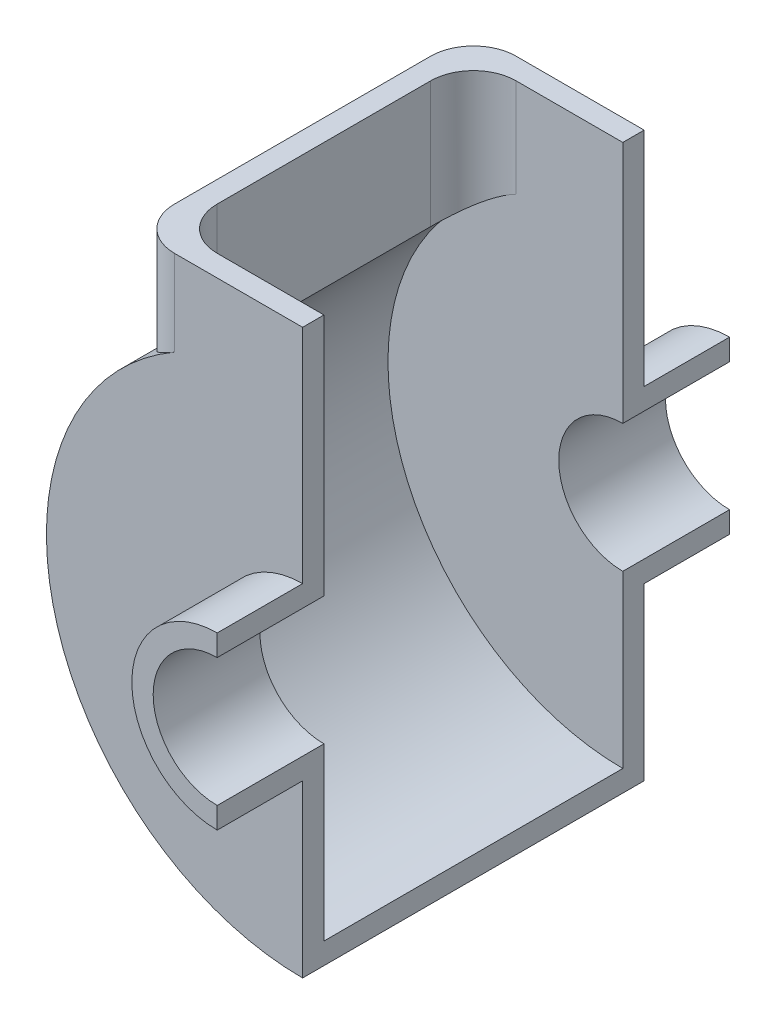
ISO-10303-21;
HEADER;
FILE_DESCRIPTION(('STEP AP214'),'2;1');
FILE_NAME('part.step','',(''),(''),'','','');
FILE_SCHEMA(('AUTOMOTIVE_DESIGN { 1 0 10303 214 1 1 1 1 }'));
ENDSEC;
DATA;
#1=APPLICATION_CONTEXT('core data for automotive mechanical design processes');
#2=APPLICATION_PROTOCOL_DEFINITION('international standard','automotive_design',2000,#1);
#3=PRODUCT_CONTEXT('',#1,'mechanical');
#4=PRODUCT('Part','Part','',(#3));
#5=PRODUCT_RELATED_PRODUCT_CATEGORY('part','',(#4));
#6=PRODUCT_DEFINITION_FORMATION('','',#4);
#7=PRODUCT_DEFINITION_CONTEXT('part definition',#1,'design');
#8=PRODUCT_DEFINITION('design','',#6,#7);
#9=PRODUCT_DEFINITION_SHAPE('','',#8);
#10=(LENGTH_UNIT() NAMED_UNIT(*) SI_UNIT(.MILLI.,.METRE.));
#11=(NAMED_UNIT(*) PLANE_ANGLE_UNIT() SI_UNIT($,.RADIAN.));
#12=(NAMED_UNIT(*) SI_UNIT($,.STERADIAN.) SOLID_ANGLE_UNIT());
#13=UNCERTAINTY_MEASURE_WITH_UNIT(LENGTH_MEASURE(1.E-05),#10,'distance_accuracy_value','');
#14=(GEOMETRIC_REPRESENTATION_CONTEXT(3) GLOBAL_UNCERTAINTY_ASSIGNED_CONTEXT((#13)) GLOBAL_UNIT_ASSIGNED_CONTEXT((#10,
#11,#12)) REPRESENTATION_CONTEXT('',''));
#15=CARTESIAN_POINT('',(0.,0.,0.));
#16=DIRECTION('',(0.,0.,1.));
#17=DIRECTION('',(1.,0.,0.));
#18=AXIS2_PLACEMENT_3D('',#15,#16,#17);
#19=CARTESIAN_POINT('',(0.,0.,25.));
#20=DIRECTION('',(0.,0.,-1.));
#21=DIRECTION('',(-1.,0.,0.));
#22=AXIS2_PLACEMENT_3D('',#19,#20,#21);
#23=CYLINDRICAL_SURFACE('',#22,20.);
#24=CARTESIAN_POINT('',(0.,0.,5.));
#25=DIRECTION('',(0.,0.,1.));
#26=DIRECTION('',(1.,0.,0.));
#27=AXIS2_PLACEMENT_3D('',#24,#25,#26);
#28=CIRCLE('',#27,20.);
#29=CARTESIAN_POINT('',(0.,20.,5.));
#30=VERTEX_POINT('',#29);
#31=CARTESIAN_POINT('',(0.,-20.,5.));
#32=VERTEX_POINT('',#31);
#33=EDGE_CURVE('E273',#30,#32,#28,.T.);
#34=ORIENTED_EDGE('',*,*,#33,.T.);
#35=DIRECTION('',(0.,0.,-1.));
#36=VECTOR('',#35,1.);
#37=CARTESIAN_POINT('',(0.,-20.,25.));
#38=LINE('',#37,#36);
#39=CARTESIAN_POINT('',(0.,-20.,25.));
#40=VERTEX_POINT('',#39);
#41=EDGE_CURVE('E308',#40,#32,#38,.T.);
#42=ORIENTED_EDGE('',*,*,#41,.F.);
#43=CARTESIAN_POINT('',(0.,0.,25.));
#44=DIRECTION('',(0.,0.,1.));
#45=DIRECTION('',(1.,0.,0.));
#46=AXIS2_PLACEMENT_3D('',#43,#44,#45);
#47=CIRCLE('',#46,20.);
#48=CARTESIAN_POINT('',(0.,20.,25.));
#49=VERTEX_POINT('',#48);
#50=EDGE_CURVE('E289',#49,#40,#47,.T.);
#51=ORIENTED_EDGE('',*,*,#50,.F.);
#52=DIRECTION('',(0.,0.,-1.));
#53=VECTOR('',#52,1.);
#54=CARTESIAN_POINT('',(0.,20.,25.));
#55=LINE('',#54,#53);
#56=EDGE_CURVE('E310',#49,#30,#55,.T.);
#57=ORIENTED_EDGE('',*,*,#56,.T.);
#58=EDGE_LOOP('',(#34,#42,#51,#57));
#59=FACE_BOUND('',#58,.T.);
#60=ADVANCED_FACE('F46',(#59),#23,.T.);
#61=CARTESIAN_POINT('',(0.,15.,25.));
#62=DIRECTION('',(-1.,0.,0.));
#63=DIRECTION('',(0.,-1.,0.));
#64=AXIS2_PLACEMENT_3D('',#61,#62,#63);
#65=PLANE('',#64);
#66=DIRECTION('',(0.,1.,0.));
#67=VECTOR('',#66,1.);
#68=CARTESIAN_POINT('',(0.,15.,0.));
#69=LINE('',#68,#67);
#70=CARTESIAN_POINT('',(0.,15.,0.));
#71=VERTEX_POINT('',#70);
#72=CARTESIAN_POINT('',(0.,72.,0.));
#73=VERTEX_POINT('',#72);
#74=EDGE_CURVE('E285',#71,#73,#69,.T.);
#75=ORIENTED_EDGE('',*,*,#74,.T.);
#76=DIRECTION('',(0.,0.,-1.));
#77=VECTOR('',#76,1.);
#78=CARTESIAN_POINT('',(0.,72.,5.));
#79=LINE('',#78,#77);
#80=CARTESIAN_POINT('',(0.,72.,5.));
#81=VERTEX_POINT('',#80);
#82=EDGE_CURVE('E201',#81,#73,#79,.T.);
#83=ORIENTED_EDGE('',*,*,#82,.F.);
#84=DIRECTION('',(0.,1.,0.));
#85=VECTOR('',#84,1.);
#86=CARTESIAN_POINT('',(0.,20.,5.));
#87=LINE('',#86,#85);
#88=EDGE_CURVE('E275',#30,#81,#87,.T.);
#89=ORIENTED_EDGE('',*,*,#88,.F.);
#90=ORIENTED_EDGE('',*,*,#56,.F.);
#91=DIRECTION('',(0.,1.,0.));
#92=VECTOR('',#91,1.);
#93=CARTESIAN_POINT('',(0.,15.,25.));
#94=LINE('',#93,#92);
#95=CARTESIAN_POINT('',(0.,15.,25.));
#96=VERTEX_POINT('',#95);
#97=EDGE_CURVE('E286',#96,#49,#94,.T.);
#98=ORIENTED_EDGE('',*,*,#97,.F.);
#99=DIRECTION('',(0.,0.,-1.));
#100=VECTOR('',#99,1.);
#101=CARTESIAN_POINT('',(0.,15.,25.));
#102=LINE('',#101,#100);
#103=EDGE_CURVE('E298',#96,#71,#102,.T.);
#104=ORIENTED_EDGE('',*,*,#103,.T.);
#105=EDGE_LOOP('',(#75,#83,#89,#90,#98,#104));
#106=FACE_BOUND('',#105,.T.);
#107=ADVANCED_FACE('F389',(#106),#65,.F.);
#108=CARTESIAN_POINT('',(0.,-15.,25.));
#109=DIRECTION('',(1.,0.,0.));
#110=DIRECTION('',(0.,1.,0.));
#111=AXIS2_PLACEMENT_3D('',#108,#109,#110);
#112=PLANE('',#111);
#113=DIRECTION('',(0.,-1.,0.));
#114=VECTOR('',#113,1.);
#115=CARTESIAN_POINT('',(0.,-15.,0.));
#116=LINE('',#115,#114);
#117=CARTESIAN_POINT('',(0.,-15.,0.));
#118=VERTEX_POINT('',#117);
#119=CARTESIAN_POINT('',(0.,-55.,0.));
#120=VERTEX_POINT('',#119);
#121=EDGE_CURVE('E300',#118,#120,#116,.T.);
#122=ORIENTED_EDGE('',*,*,#121,.F.);
#123=DIRECTION('',(0.,0.,-1.));
#124=VECTOR('',#123,1.);
#125=CARTESIAN_POINT('',(0.,-15.,25.));
#126=LINE('',#125,#124);
#127=CARTESIAN_POINT('',(0.,-15.,25.));
#128=VERTEX_POINT('',#127);
#129=EDGE_CURVE('E306',#128,#118,#126,.T.);
#130=ORIENTED_EDGE('',*,*,#129,.F.);
#131=DIRECTION('',(0.,-1.,0.));
#132=VECTOR('',#131,1.);
#133=CARTESIAN_POINT('',(0.,-15.,25.));
#134=LINE('',#133,#132);
#135=EDGE_CURVE('E292',#128,#40,#134,.T.);
#136=ORIENTED_EDGE('',*,*,#135,.T.);
#137=ORIENTED_EDGE('',*,*,#41,.T.);
#138=DIRECTION('',(0.,-1.,0.));
#139=VECTOR('',#138,1.);
#140=CARTESIAN_POINT('',(0.,-20.,5.));
#141=LINE('',#140,#139);
#142=CARTESIAN_POINT('',(0.,-60.,5.));
#143=VERTEX_POINT('',#142);
#144=EDGE_CURVE('E199',#32,#143,#141,.T.);
#145=ORIENTED_EDGE('',*,*,#144,.T.);
#146=DIRECTION('',(0.,0.,-1.));
#147=VECTOR('',#146,1.);
#148=CARTESIAN_POINT('',(0.,-60.,5.));
#149=LINE('',#148,#147);
#150=CARTESIAN_POINT('',(0.,-60.,-75.));
#151=VERTEX_POINT('',#150);
#152=EDGE_CURVE('E189',#143,#151,#149,.T.);
#153=ORIENTED_EDGE('',*,*,#152,.T.);
#154=DIRECTION('',(0.,-1.,0.));
#155=VECTOR('',#154,1.);
#156=CARTESIAN_POINT('',(0.,-20.,-75.));
#157=LINE('',#156,#155);
#158=CARTESIAN_POINT('',(0.,-20.,-75.));
#159=VERTEX_POINT('',#158);
#160=EDGE_CURVE('E195',#159,#151,#157,.T.);
#161=ORIENTED_EDGE('',*,*,#160,.F.);
#162=DIRECTION('',(0.,0.,1.));
#163=VECTOR('',#162,1.);
#164=CARTESIAN_POINT('',(0.,-20.,-95.));
#165=LINE('',#164,#163);
#166=CARTESIAN_POINT('',(0.,-20.,-95.));
#167=VERTEX_POINT('',#166);
#168=EDGE_CURVE('E251',#167,#159,#165,.T.);
#169=ORIENTED_EDGE('',*,*,#168,.F.);
#170=DIRECTION('',(0.,-1.,0.));
#171=VECTOR('',#170,1.);
#172=CARTESIAN_POINT('',(0.,-15.,-95.));
#173=LINE('',#172,#171);
#174=CARTESIAN_POINT('',(0.,-15.,-95.));
#175=VERTEX_POINT('',#174);
#176=EDGE_CURVE('E235',#175,#167,#173,.T.);
#177=ORIENTED_EDGE('',*,*,#176,.F.);
#178=DIRECTION('',(0.,0.,1.));
#179=VECTOR('',#178,1.);
#180=CARTESIAN_POINT('',(0.,-15.,-95.));
#181=LINE('',#180,#179);
#182=CARTESIAN_POINT('',(0.,-15.,-70.));
#183=VERTEX_POINT('',#182);
#184=EDGE_CURVE('E248',#175,#183,#181,.T.);
#185=ORIENTED_EDGE('',*,*,#184,.T.);
#186=DIRECTION('',(0.,-1.,0.));
#187=VECTOR('',#186,1.);
#188=CARTESIAN_POINT('',(0.,-15.,-70.));
#189=LINE('',#188,#187);
#190=CARTESIAN_POINT('',(0.,-55.,-70.));
#191=VERTEX_POINT('',#190);
#192=EDGE_CURVE('E242',#183,#191,#189,.T.);
#193=ORIENTED_EDGE('',*,*,#192,.T.);
#194=DIRECTION('',(0.,0.,1.));
#195=VECTOR('',#194,1.);
#196=CARTESIAN_POINT('',(0.,-55.,-95.002));
#197=LINE('',#196,#195);
#198=EDGE_CURVE('E258',#191,#120,#197,.T.);
#199=ORIENTED_EDGE('',*,*,#198,.T.);
#200=EDGE_LOOP('',(#122,#130,#136,#137,#145,#153,#161,#169,#177,#185,#193,#199));
#201=FACE_BOUND('',#200,.T.);
#202=ADVANCED_FACE('F192',(#201),#112,.T.);
#203=CARTESIAN_POINT('',(0.,0.,25.));
#204=DIRECTION('',(0.,0.,-1.));
#205=DIRECTION('',(-1.,0.,0.));
#206=AXIS2_PLACEMENT_3D('',#203,#204,#205);
#207=CYLINDRICAL_SURFACE('',#206,15.);
#208=CARTESIAN_POINT('',(0.,0.,0.));
#209=DIRECTION('',(0.,0.,1.));
#210=DIRECTION('',(1.,0.,0.));
#211=AXIS2_PLACEMENT_3D('',#208,#209,#210);
#212=CIRCLE('',#211,15.);
#213=EDGE_CURVE('E290',#71,#118,#212,.T.);
#214=ORIENTED_EDGE('',*,*,#213,.F.);
#215=ORIENTED_EDGE('',*,*,#103,.F.);
#216=CARTESIAN_POINT('',(0.,0.,25.));
#217=DIRECTION('',(0.,0.,1.));
#218=DIRECTION('',(1.,0.,0.));
#219=AXIS2_PLACEMENT_3D('',#216,#217,#218);
#220=CIRCLE('',#219,15.);
#221=EDGE_CURVE('E295',#96,#128,#220,.T.);
#222=ORIENTED_EDGE('',*,*,#221,.T.);
#223=ORIENTED_EDGE('',*,*,#129,.T.);
#224=EDGE_LOOP('',(#214,#215,#222,#223));
#225=FACE_BOUND('',#224,.T.);
#226=ADVANCED_FACE('F399',(#225),#207,.F.);
#227=CARTESIAN_POINT('',(0.,0.,25.));
#228=DIRECTION('',(0.,0.,1.));
#229=DIRECTION('',(1.,0.,0.));
#230=AXIS2_PLACEMENT_3D('',#227,#228,#229);
#231=PLANE('',#230);
#232=ORIENTED_EDGE('',*,*,#97,.T.);
#233=ORIENTED_EDGE('',*,*,#50,.T.);
#234=ORIENTED_EDGE('',*,*,#135,.F.);
#235=ORIENTED_EDGE('',*,*,#221,.F.);
#236=EDGE_LOOP('',(#232,#233,#234,#235));
#237=FACE_BOUND('',#236,.T.);
#238=ADVANCED_FACE('F402',(#237),#231,.T.);
#239=CARTESIAN_POINT('',(0.,0.,0.));
#240=DIRECTION('',(0.,0.,1.));
#241=DIRECTION('',(1.,0.,0.));
#242=AXIS2_PLACEMENT_3D('',#239,#240,#241);
#243=PLANE('',#242);
#244=CARTESIAN_POINT('',(0.,0.,0.));
#245=DIRECTION('',(0.,0.,-1.));
#246=DIRECTION('',(-1.,0.,0.));
#247=AXIS2_PLACEMENT_3D('',#244,#245,#246);
#248=CIRCLE('',#247,55.);
#249=CARTESIAN_POINT('',(-25.,48.9897948556636,0.));
#250=VERTEX_POINT('',#249);
#251=EDGE_CURVE('E256',#120,#250,#248,.T.);
#252=ORIENTED_EDGE('',*,*,#251,.T.);
#253=DIRECTION('',(0.,1.,0.));
#254=VECTOR('',#253,1.);
#255=CARTESIAN_POINT('',(-25.,0.,0.));
#256=LINE('',#255,#254);
#257=CARTESIAN_POINT('',(-25.,72.,0.));
#258=VERTEX_POINT('',#257);
#259=EDGE_CURVE('E312',#250,#258,#256,.T.);
#260=ORIENTED_EDGE('',*,*,#259,.T.);
#261=DIRECTION('',(-1.,0.,0.));
#262=VECTOR('',#261,1.);
#263=CARTESIAN_POINT('',(0.,72.,0.));
#264=LINE('',#263,#262);
#265=EDGE_CURVE('E268',#73,#258,#264,.T.);
#266=ORIENTED_EDGE('',*,*,#265,.F.);
#267=ORIENTED_EDGE('',*,*,#74,.F.);
#268=ORIENTED_EDGE('',*,*,#213,.T.);
#269=ORIENTED_EDGE('',*,*,#121,.T.);
#270=EDGE_LOOP('',(#252,#260,#266,#267,#268,#269));
#271=FACE_BOUND('',#270,.T.);
#272=ADVANCED_FACE('F404',(#271),#243,.F.);
#273=CARTESIAN_POINT('',(0.,72.,5.));
#274=DIRECTION('',(0.,-1.,0.));
#275=DIRECTION('',(0.,0.,-1.));
#276=AXIS2_PLACEMENT_3D('',#273,#274,#275);
#277=PLANE('',#276);
#278=DIRECTION('',(-1.,0.,0.));
#279=VECTOR('',#278,1.);
#280=CARTESIAN_POINT('',(0.,72.,-75.));
#281=LINE('',#280,#279);
#282=CARTESIAN_POINT('',(0.,72.,-75.));
#283=VERTEX_POINT('',#282);
#284=CARTESIAN_POINT('',(-30.,72.,-75.));
#285=VERTEX_POINT('',#284);
#286=EDGE_CURVE('E209',#283,#285,#281,.T.);
#287=ORIENTED_EDGE('',*,*,#286,.T.);
#288=CARTESIAN_POINT('',(-30.,72.,-65.));
#289=DIRECTION('',(0.,-1.,0.));
#290=DIRECTION('',(0.,0.,-1.));
#291=AXIS2_PLACEMENT_3D('',#288,#289,#290);
#292=CIRCLE('',#291,10.);
#293=CARTESIAN_POINT('',(-40.,72.,-65.));
#294=VERTEX_POINT('',#293);
#295=EDGE_CURVE('E331',#285,#294,#292,.F.);
#296=ORIENTED_EDGE('',*,*,#295,.T.);
#297=DIRECTION('',(0.,0.,-1.));
#298=VECTOR('',#297,1.);
#299=CARTESIAN_POINT('',(-40.,72.,5.));
#300=LINE('',#299,#298);
#301=CARTESIAN_POINT('',(-40.,72.,-5.));
#302=VERTEX_POINT('',#301);
#303=EDGE_CURVE('E282',#302,#294,#300,.T.);
#304=ORIENTED_EDGE('',*,*,#303,.F.);
#305=CARTESIAN_POINT('',(-30.,72.,-5.));
#306=DIRECTION('',(0.,-1.,0.));
#307=DIRECTION('',(0.,0.,-1.));
#308=AXIS2_PLACEMENT_3D('',#305,#306,#307);
#309=CIRCLE('',#308,10.);
#310=CARTESIAN_POINT('',(-30.,72.,5.));
#311=VERTEX_POINT('',#310);
#312=EDGE_CURVE('E74',#302,#311,#309,.F.);
#313=ORIENTED_EDGE('',*,*,#312,.T.);
#314=DIRECTION('',(-1.,0.,0.));
#315=VECTOR('',#314,1.);
#316=CARTESIAN_POINT('',(0.,72.,5.));
#317=LINE('',#316,#315);
#318=EDGE_CURVE('E269',#81,#311,#317,.T.);
#319=ORIENTED_EDGE('',*,*,#318,.F.);
#320=ORIENTED_EDGE('',*,*,#82,.T.);
#321=ORIENTED_EDGE('',*,*,#265,.T.);
#322=CARTESIAN_POINT('',(-25.,72.,-10.));
#323=DIRECTION('',(0.,-1.,0.));
#324=DIRECTION('',(0.,0.,-1.));
#325=AXIS2_PLACEMENT_3D('',#322,#323,#324);
#326=CIRCLE('',#325,10.);
#327=CARTESIAN_POINT('',(-35.,72.,-9.99999999999999));
#328=VERTEX_POINT('',#327);
#329=EDGE_CURVE('E336',#258,#328,#326,.T.);
#330=ORIENTED_EDGE('',*,*,#329,.T.);
#331=DIRECTION('',(0.,0.,1.));
#332=VECTOR('',#331,1.);
#333=CARTESIAN_POINT('',(-35.,72.,-95.002));
#334=LINE('',#333,#332);
#335=CARTESIAN_POINT('',(-35.,72.,-60.));
#336=VERTEX_POINT('',#335);
#337=EDGE_CURVE('E259',#336,#328,#334,.T.);
#338=ORIENTED_EDGE('',*,*,#337,.F.);
#339=CARTESIAN_POINT('',(-25.,72.,-60.));
#340=DIRECTION('',(0.,-1.,0.));
#341=DIRECTION('',(0.,0.,-1.));
#342=AXIS2_PLACEMENT_3D('',#339,#340,#341);
#343=CIRCLE('',#342,10.);
#344=CARTESIAN_POINT('',(-25.,72.,-70.));
#345=VERTEX_POINT('',#344);
#346=EDGE_CURVE('E347',#336,#345,#343,.T.);
#347=ORIENTED_EDGE('',*,*,#346,.T.);
#348=DIRECTION('',(-1.,0.,0.));
#349=VECTOR('',#348,1.);
#350=CARTESIAN_POINT('',(0.,72.,-70.));
#351=LINE('',#350,#349);
#352=CARTESIAN_POINT('',(0.,72.,-70.));
#353=VERTEX_POINT('',#352);
#354=EDGE_CURVE('E223',#353,#345,#351,.T.);
#355=ORIENTED_EDGE('',*,*,#354,.F.);
#356=DIRECTION('',(0.,0.,1.));
#357=VECTOR('',#356,1.);
#358=CARTESIAN_POINT('',(0.,72.,-75.));
#359=LINE('',#358,#357);
#360=EDGE_CURVE('E222',#283,#353,#359,.T.);
#361=ORIENTED_EDGE('',*,*,#360,.F.);
#362=EDGE_LOOP('',(#287,#296,#304,#313,#319,#320,#321,#330,#338,#347,#355,#361));
#363=FACE_BOUND('',#362,.T.);
#364=ADVANCED_FACE('F407',(#363),#277,.F.);
#365=CARTESIAN_POINT('',(-40.,72.,5.));
#366=DIRECTION('',(1.,0.,0.));
#367=DIRECTION('',(0.,1.,0.));
#368=AXIS2_PLACEMENT_3D('',#365,#366,#367);
#369=PLANE('',#368);
#370=ORIENTED_EDGE('',*,*,#303,.T.);
#371=DIRECTION('',(0.,-1.,0.));
#372=VECTOR('',#371,1.);
#373=CARTESIAN_POINT('',(-40.,72.,-65.));
#374=LINE('',#373,#372);
#375=CARTESIAN_POINT('',(-40.,44.7213595499958,-65.));
#376=VERTEX_POINT('',#375);
#377=EDGE_CURVE('E325',#294,#376,#374,.T.);
#378=ORIENTED_EDGE('',*,*,#377,.T.);
#379=DIRECTION('',(0.,0.,-1.));
#380=VECTOR('',#379,1.);
#381=CARTESIAN_POINT('',(-40.,44.7213595499958,5.));
#382=LINE('',#381,#380);
#383=CARTESIAN_POINT('',(-40.,44.7213595499958,-5.));
#384=VERTEX_POINT('',#383);
#385=EDGE_CURVE('E200',#384,#376,#382,.T.);
#386=ORIENTED_EDGE('',*,*,#385,.F.);
#387=DIRECTION('',(0.,-1.,0.));
#388=VECTOR('',#387,1.);
#389=CARTESIAN_POINT('',(-40.,72.,-5.));
#390=LINE('',#389,#388);
#391=EDGE_CURVE('E323',#384,#302,#390,.F.);
#392=ORIENTED_EDGE('',*,*,#391,.T.);
#393=EDGE_LOOP('',(#370,#378,#386,#392));
#394=FACE_BOUND('',#393,.T.);
#395=ADVANCED_FACE('F414',(#394),#369,.F.);
#396=CARTESIAN_POINT('',(0.,0.,5.));
#397=DIRECTION('',(0.,0.,-1.));
#398=DIRECTION('',(-1.,0.,0.));
#399=AXIS2_PLACEMENT_3D('',#396,#397,#398);
#400=CYLINDRICAL_SURFACE('',#399,60.);
#401=CARTESIAN_POINT('',(0.,0.,5.));
#402=DIRECTION('',(0.,0.,-1.));
#403=DIRECTION('',(-1.,0.,0.));
#404=AXIS2_PLACEMENT_3D('',#401,#402,#403);
#405=CIRCLE('',#404,60.);
#406=CARTESIAN_POINT('',(-30.,51.9615242270663,5.));
#407=VERTEX_POINT('',#406);
#408=EDGE_CURVE('E66',#143,#407,#405,.T.);
#409=ORIENTED_EDGE('',*,*,#408,.T.);
#410=CARTESIAN_POINT('',(-30.,51.9615242270663,5.));
#411=CARTESIAN_POINT('',(-30.1846403402756,51.8549243575684,4.99999694467445));
#412=CARTESIAN_POINT('',(-30.3686755821332,51.7473565843307,4.99488587812623));
#413=CARTESIAN_POINT('',(-30.7351668388072,51.5305231450817,4.97462918627216));
#414=CARTESIAN_POINT('',(-30.9176229894396,51.4212576273974,4.95948443281986));
#415=CARTESIAN_POINT('',(-31.4619253243051,51.0913595980358,4.89929167200636));
#416=CARTESIAN_POINT('',(-31.8209014856786,50.868512343648,4.83948477245505));
#417=CARTESIAN_POINT('',(-32.5288887310146,50.418725257113,4.68176841927459));
#418=CARTESIAN_POINT('',(-32.8778736192083,50.1917768316845,4.5837671788936));
#419=CARTESIAN_POINT('',(-33.562476910193,49.7365966241752,4.35090696893926));
#420=CARTESIAN_POINT('',(-33.8980954977704,49.5083648598861,4.21604850911225));
#421=CARTESIAN_POINT('',(-34.520729602458,49.0759439346811,3.92574534472068));
#422=CARTESIAN_POINT('',(-34.8092512536601,48.8716304811259,3.77370267176126));
#423=CARTESIAN_POINT('',(-35.3716903107987,48.4661085573826,3.44107089228342));
#424=CARTESIAN_POINT('',(-35.6456079007732,48.2649000480893,3.26048214561176));
#425=CARTESIAN_POINT('',(-36.1765727574088,47.8682074936152,2.87135112309205));
#426=CARTESIAN_POINT('',(-36.4336405194033,47.6727166603459,2.66284378257167));
#427=CARTESIAN_POINT('',(-36.9290721152615,47.289972828363,2.21794621899144));
#428=CARTESIAN_POINT('',(-37.167441451851,47.1027174132443,1.98156425075618));
#429=CARTESIAN_POINT('',(-37.565018182153,46.785859634165,1.54478146403292));
#430=CARTESIAN_POINT('',(-37.7289458526818,46.6537017113221,1.35050833176437));
#431=CARTESIAN_POINT('',(-38.043765038696,46.397339573439,0.946710505836687));
#432=CARTESIAN_POINT('',(-38.1946575996422,46.2731347207424,0.737187037795447));
#433=CARTESIAN_POINT('',(-38.4818360085844,46.0345861261904,0.303399948510738));
#434=CARTESIAN_POINT('',(-38.618136880254,45.9202322658759,0.0791518792914355));
#435=CARTESIAN_POINT('',(-38.8746918035924,45.7032445431668,-0.383743447816966));
#436=CARTESIAN_POINT('',(-38.9949492411763,45.6006082084878,-0.622387651960063));
#437=CARTESIAN_POINT('',(-39.1965662504922,45.4273417305266,-1.06669402634214));
#438=CARTESIAN_POINT('',(-39.2809795718103,45.3543309967536,-1.27004581930021));
#439=CARTESIAN_POINT('',(-39.437114382813,45.2186323209963,-1.68488791321454));
#440=CARTESIAN_POINT('',(-39.508838494378,45.1559422467147,-1.89637652189831));
#441=CARTESIAN_POINT('',(-39.6385128100447,45.0421551914612,-2.32617263610176));
#442=CARTESIAN_POINT('',(-39.6964869139818,44.9910381018204,-2.54446755239788));
#443=CARTESIAN_POINT('',(-39.7978943535571,44.9013606141582,-2.986852666006));
#444=CARTESIAN_POINT('',(-39.8413328734582,44.8627957393971,-3.21094076633609));
#445=CARTESIAN_POINT('',(-39.9177189665931,44.7948514731765,-3.69377442824111));
#446=CARTESIAN_POINT('',(-39.9484884415043,44.7673886419263,-3.95314914513774));
#447=CARTESIAN_POINT('',(-39.9793476433001,44.7398248250479,-4.34440444684135));
#448=CARTESIAN_POINT('',(-39.987084921451,44.7329085695169,-4.47527578752073));
#449=CARTESIAN_POINT('',(-39.9974129661721,44.7236736235071,-4.73742237599204));
#450=CARTESIAN_POINT('',(-40.0000021863485,44.7213563144782,-4.86869773328782));
#451=CARTESIAN_POINT('',(-40.,44.7213595499958,-5.));
#452=B_SPLINE_CURVE_WITH_KNOTS('',3,(#410,#411,#412,#413,#414,#415,#416,#417,#418,#419,#420,
#421,#422,#423,#424,#425,#426,#427,#428,#429,#430,#431,#432,#433,#434,#435,#436,#437,#438,#439,
#440,#441,#442,#443,#444,#445,#446,#447,#448,#449,#450,#451),.UNSPECIFIED.,.F.,.F.,(4,2,2,2,2,2,
2,2,2,2,2,2,2,2,2,2,2,2,2,2,4),(0.,0.639469988122805,1.27888441829631,2.55703672344089,
3.83827975129429,5.11950506007104,6.27274736359204,7.42597513070352,8.5777730871098,
9.72923080131074,10.5879927572485,11.4466857734357,12.3044859953459,13.1621048939207,
13.8573439066469,14.5524390989254,15.2463170957639,15.9399473495784,16.7262834977137,
17.1199731890566,17.5137811205932),.UNSPECIFIED.);
#453=EDGE_CURVE('E13',#407,#384,#452,.T.);
#454=ORIENTED_EDGE('',*,*,#453,.T.);
#455=ORIENTED_EDGE('',*,*,#385,.T.);
#456=CARTESIAN_POINT('',(-40.,44.7213595499958,-65.));
#457=CARTESIAN_POINT('',(-40.0000015812733,44.7213573011344,-65.1176634010021));
#458=CARTESIAN_POINT('',(-39.9979227141808,44.7232176305845,-65.2353086549857));
#459=CARTESIAN_POINT('',(-39.9896253110866,44.7306372942271,-65.4703286016599));
#460=CARTESIAN_POINT('',(-39.9834070494192,44.7361963832882,-65.5877033117632));
#461=CARTESIAN_POINT('',(-39.9585923280535,44.7583670958171,-65.9388427467587));
#462=CARTESIAN_POINT('',(-39.9338358355778,44.7804722797486,-66.1718758054602));
#463=CARTESIAN_POINT('',(-39.8686644525486,44.8385042167554,-66.6318691326489));
#464=CARTESIAN_POINT('',(-39.8283855148165,44.8743109465834,-66.8588643223737));
#465=CARTESIAN_POINT('',(-39.7328892662281,44.9588875680342,-67.3072524479117));
#466=CARTESIAN_POINT('',(-39.6776696039361,45.0076595001554,-67.5286444958756));
#467=CARTESIAN_POINT('',(-39.5534118644793,45.1168972505339,-67.9636688649734));
#468=CARTESIAN_POINT('',(-39.4844211995899,45.1773229225701,-68.1773249178853));
#469=CARTESIAN_POINT('',(-39.3334605195833,45.3088170177995,-68.5966936542645));
#470=CARTESIAN_POINT('',(-39.2514857085459,45.3798893730022,-68.8024033675523));
#471=CARTESIAN_POINT('',(-39.0753863002099,45.5316122169457,-69.2054529377369));
#472=CARTESIAN_POINT('',(-38.9812363061758,45.6122826978885,-69.4027741200324));
#473=CARTESIAN_POINT('',(-38.7818943790383,45.7818938454653,-69.788046749896));
#474=CARTESIAN_POINT('',(-38.6767013504078,45.8708353325264,-69.9759972651116));
#475=CARTESIAN_POINT('',(-38.4135728743112,46.0916172160901,-70.4129070483267));
#476=CARTESIAN_POINT('',(-38.2509572804995,46.2267600621542,-70.6573967975821));
#477=CARTESIAN_POINT('',(-37.908447036405,46.5080507377658,-71.1270697633622));
#478=CARTESIAN_POINT('',(-37.728551713043,46.6541989959475,-71.3522522271834));
#479=CARTESIAN_POINT('',(-37.3531054007839,46.9553345195759,-71.7833337426989));
#480=CARTESIAN_POINT('',(-37.1575367002328,47.1103317262239,-71.9892103913973));
#481=CARTESIAN_POINT('',(-36.7525951751676,47.4269223387039,-72.3811838692743));
#482=CARTESIAN_POINT('',(-36.5432234671629,47.5885152106185,-72.5672822951176));
#483=CARTESIAN_POINT('',(-35.889352420626,48.0859277319981,-73.1015951815724));
#484=CARTESIAN_POINT('',(-35.4251261289153,48.429498559668,-73.4189829871174));
#485=CARTESIAN_POINT('',(-34.4553726874119,49.1241578823887,-73.9699716496598));
#486=CARTESIAN_POINT('',(-33.9498747171002,49.4752409388269,-74.2036310842669));
#487=CARTESIAN_POINT('',(-33.1568278633415,50.0073212539565,-74.4930456878643));
#488=CARTESIAN_POINT('',(-32.8810021018505,50.1891501210001,-74.5803819665683));
#489=CARTESIAN_POINT('',(-32.3217375725054,50.5511235483305,-74.7310524671282));
#490=CARTESIAN_POINT('',(-32.0382991780871,50.7312681906542,-74.7943878640467));
#491=CARTESIAN_POINT('',(-31.4650006560554,51.0888227050653,-74.8963939978526));
#492=CARTESIAN_POINT('',(-31.1751356203563,51.2662302982853,-74.935045161166));
#493=CARTESIAN_POINT('',(-30.5906934832528,51.6171131325133,-74.9868485137105));
#494=CARTESIAN_POINT('',(-30.2961152167169,51.7905873747387,-74.9999942965489));
#495=CARTESIAN_POINT('',(-30.,51.9615242270663,-75.));
#496=B_SPLINE_CURVE_WITH_KNOTS('',3,(#456,#457,#458,#459,#460,#461,#462,#463,#464,#465,#466,
#467,#468,#469,#470,#471,#472,#473,#474,#475,#476,#477,#478,#479,#480,#481,#482,#483,#484,#485,
#486,#487,#488,#489,#490,#491,#492,#493,#494,#495),.UNSPECIFIED.,.F.,.F.,(4,2,2,2,2,2,2,2,2,2,2,
2,2,2,2,2,2,2,2,4),(0.,0.352921378883185,0.705819370583172,1.41085932128629,2.10985961734753,
2.80896998914977,3.50571366437716,4.2027152967345,4.90119502233958,5.59974410640154,
6.5680578816333,7.53640938987799,8.50587104319846,9.47525437387455,11.4447404103531,
13.4128458625583,14.4372042618812,15.4615125030147,16.4866319729198,17.5120088970542),.UNSPECIFIED.);
#497=CARTESIAN_POINT('',(-30.,51.9615242270663,-75.));
#498=VERTEX_POINT('',#497);
#499=EDGE_CURVE('E60',#376,#498,#496,.T.);
#500=ORIENTED_EDGE('',*,*,#499,.T.);
#501=CARTESIAN_POINT('',(0.,0.,-75.));
#502=DIRECTION('',(0.,0.,-1.));
#503=DIRECTION('',(-1.,0.,0.));
#504=AXIS2_PLACEMENT_3D('',#501,#502,#503);
#505=CIRCLE('',#504,60.);
#506=EDGE_CURVE('E204',#151,#498,#505,.T.);
#507=ORIENTED_EDGE('',*,*,#506,.F.);
#508=ORIENTED_EDGE('',*,*,#152,.F.);
#509=EDGE_LOOP('',(#409,#454,#455,#500,#507,#508));
#510=FACE_BOUND('',#509,.T.);
#511=ADVANCED_FACE('F205',(#510),#400,.T.);
#512=CARTESIAN_POINT('',(0.,0.,5.));
#513=DIRECTION('',(0.,0.,-1.));
#514=DIRECTION('',(-1.,0.,0.));
#515=AXIS2_PLACEMENT_3D('',#512,#513,#514);
#516=PLANE('',#515);
#517=ORIENTED_EDGE('',*,*,#318,.T.);
#518=DIRECTION('',(0.,-1.,0.));
#519=VECTOR('',#518,1.);
#520=CARTESIAN_POINT('',(-30.,0.,5.));
#521=LINE('',#520,#519);
#522=EDGE_CURVE('E333',#311,#407,#521,.T.);
#523=ORIENTED_EDGE('',*,*,#522,.T.);
#524=ORIENTED_EDGE('',*,*,#408,.F.);
#525=ORIENTED_EDGE('',*,*,#144,.F.);
#526=ORIENTED_EDGE('',*,*,#33,.F.);
#527=ORIENTED_EDGE('',*,*,#88,.T.);
#528=EDGE_LOOP('',(#517,#523,#524,#525,#526,#527));
#529=FACE_BOUND('',#528,.T.);
#530=ADVANCED_FACE('F361',(#529),#516,.F.);
#531=CARTESIAN_POINT('',(-35.,72.,-95.002));
#532=DIRECTION('',(1.,0.,0.));
#533=DIRECTION('',(0.,1.,0.));
#534=AXIS2_PLACEMENT_3D('',#531,#532,#533);
#535=PLANE('',#534);
#536=ORIENTED_EDGE('',*,*,#337,.T.);
#537=DIRECTION('',(0.,1.,0.));
#538=VECTOR('',#537,1.);
#539=CARTESIAN_POINT('',(-35.,72.,-9.99999999999999));
#540=LINE('',#539,#538);
#541=CARTESIAN_POINT('',(-35.,42.4264068711928,-9.99999999999999));
#542=VERTEX_POINT('',#541);
#543=EDGE_CURVE('E318',#328,#542,#540,.F.);
#544=ORIENTED_EDGE('',*,*,#543,.T.);
#545=DIRECTION('',(0.,0.,1.));
#546=VECTOR('',#545,1.);
#547=CARTESIAN_POINT('',(-35.,42.4264068711928,-95.002));
#548=LINE('',#547,#546);
#549=CARTESIAN_POINT('',(-35.,42.4264068711928,-60.));
#550=VERTEX_POINT('',#549);
#551=EDGE_CURVE('E263',#550,#542,#548,.T.);
#552=ORIENTED_EDGE('',*,*,#551,.F.);
#553=DIRECTION('',(0.,1.,0.));
#554=VECTOR('',#553,1.);
#555=CARTESIAN_POINT('',(-35.,72.,-60.));
#556=LINE('',#555,#554);
#557=EDGE_CURVE('E315',#550,#336,#556,.T.);
#558=ORIENTED_EDGE('',*,*,#557,.T.);
#559=EDGE_LOOP('',(#536,#544,#552,#558));
#560=FACE_BOUND('',#559,.T.);
#561=ADVANCED_FACE('F359',(#560),#535,.T.);
#562=CARTESIAN_POINT('',(0.,0.,-95.002));
#563=DIRECTION('',(0.,0.,1.));
#564=DIRECTION('',(1.,0.,0.));
#565=AXIS2_PLACEMENT_3D('',#562,#563,#564);
#566=CYLINDRICAL_SURFACE('',#565,55.);
#567=ORIENTED_EDGE('',*,*,#198,.F.);
#568=CARTESIAN_POINT('',(0.,0.,-70.));
#569=DIRECTION('',(0.,0.,-1.));
#570=DIRECTION('',(-1.,0.,0.));
#571=AXIS2_PLACEMENT_3D('',#568,#569,#570);
#572=CIRCLE('',#571,55.);
#573=CARTESIAN_POINT('',(-25.,48.9897948556636,-70.));
#574=VERTEX_POINT('',#573);
#575=EDGE_CURVE('E262',#191,#574,#572,.T.);
#576=ORIENTED_EDGE('',*,*,#575,.T.);
#577=CARTESIAN_POINT('',(-25.,48.9897948556636,-70.));
#578=CARTESIAN_POINT('',(-25.1906704625853,48.8924964907343,-69.9999971656189));
#579=CARTESIAN_POINT('',(-25.3807299051036,48.7941008127997,-69.9945462068009));
#580=CARTESIAN_POINT('',(-25.7591946792121,48.5953653194177,-69.9729416657178));
#581=CARTESIAN_POINT('',(-25.947600172291,48.4950256969118,-69.9567891403815));
#582=CARTESIAN_POINT('',(-26.5095199627771,48.1915584402701,-69.8925935595296));
#583=CARTESIAN_POINT('',(-26.879966617226,47.985865462464,-69.8288120264318));
#584=CARTESIAN_POINT('',(-27.6092367230561,47.5700172433392,-69.6608532752705));
#585=CARTESIAN_POINT('',(-27.9680515865195,47.3598588865119,-69.5566469152987));
#586=CARTESIAN_POINT('',(-28.6708870947942,46.9377053718885,-69.3093143170567));
#587=CARTESIAN_POINT('',(-29.0149087495746,46.7257103406777,-69.1661907406623));
#588=CARTESIAN_POINT('',(-29.6343122240442,46.3348745882726,-68.8669502099571));
#589=CARTESIAN_POINT('',(-29.9121762835488,46.1558947290866,-68.7161192793689));
#590=CARTESIAN_POINT('',(-30.453564058984,45.8004938086764,-68.3880155176435));
#591=CARTESIAN_POINT('',(-30.7170889667725,45.6240725356815,-68.210744888747));
#592=CARTESIAN_POINT('',(-31.2277793899634,45.27605554075,-67.8304558145634));
#593=CARTESIAN_POINT('',(-31.4749603097885,45.1044553652141,-67.6274621555615));
#594=CARTESIAN_POINT('',(-31.9512644556701,44.7683103206218,-67.1960491883292));
#595=CARTESIAN_POINT('',(-32.1803914213148,44.60376399371,-66.9676351692916));
#596=CARTESIAN_POINT('',(-32.5724334975713,44.3179704705642,-66.536394282226));
#597=CARTESIAN_POINT('',(-32.7391594522469,44.1948776144083,-66.3382416976568));
#598=CARTESIAN_POINT('',(-33.0586989979014,43.956366411861,-65.9266540781595));
#599=CARTESIAN_POINT('',(-33.2115135789464,43.8409475194751,-65.7132201327334));
#600=CARTESIAN_POINT('',(-33.5016809731427,43.6196131502262,-65.2717299317311));
#601=CARTESIAN_POINT('',(-33.6390478315194,43.5136890586718,-65.0436872596241));
#602=CARTESIAN_POINT('',(-33.8968966266417,43.3131282626193,-64.5735187782177));
#603=CARTESIAN_POINT('',(-34.0173818752135,43.2184893447453,-64.3313957444228));
#604=CARTESIAN_POINT('',(-34.220345560487,43.0578872759331,-63.8775967975981));
#605=CARTESIAN_POINT('',(-34.3057864350373,42.9898029979803,-63.6679931294044));
#606=CARTESIAN_POINT('',(-34.4630420236251,42.8638412603264,-63.2407750890927));
#607=CARTESIAN_POINT('',(-34.534859392632,42.805961812048,-63.023162287697));
#608=CARTESIAN_POINT('',(-34.6638213670324,42.7015968076424,-62.5813588577465));
#609=CARTESIAN_POINT('',(-34.7209903361364,42.6550923381947,-62.357179851681));
#610=CARTESIAN_POINT('',(-34.8199345283325,42.5743613090907,-61.9033665270967));
#611=CARTESIAN_POINT('',(-34.8617157478199,42.5401299669028,-61.6737343708085));
#612=CARTESIAN_POINT('',(-34.9300837462733,42.4840120509156,-61.2045822520297));
#613=CARTESIAN_POINT('',(-34.9562545186649,42.4624636500731,-60.9649596154708));
#614=CARTESIAN_POINT('',(-34.9824752970613,42.4408592306511,-60.6039690758757));
#615=CARTESIAN_POINT('',(-34.9890430057937,42.4354441063026,-60.4833431270819));
#616=CARTESIAN_POINT('',(-34.9978062165355,42.4282167617888,-60.241817657905));
#617=CARTESIAN_POINT('',(-35.0000014553635,42.4264047584974,-60.120918121493));
#618=CARTESIAN_POINT('',(-35.,42.4264068711928,-60.));
#619=B_SPLINE_CURVE_WITH_KNOTS('',3,(#577,#578,#579,#580,#581,#582,#583,#584,#585,#586,#587,
#588,#589,#590,#591,#592,#593,#594,#595,#596,#597,#598,#599,#600,#601,#602,#603,#604,#605,#606,
#607,#608,#609,#610,#611,#612,#613,#614,#615,#616,#617,#618),.UNSPECIFIED.,.F.,.F.,(4,2,2,2,2,2,
2,2,2,2,2,2,2,2,2,2,2,2,2,2,4),(0.,0.64202515354695,1.28398690760974,2.56714249695266,
3.85122482619341,5.13521934832298,6.22394893506148,7.31258788888127,8.40018571330232,
9.4875576637522,10.3469757139952,11.2063325519534,12.0649016266237,12.9233020310802,
13.6317123054177,14.3399843815419,15.0470706749441,15.7538811342204,16.4787715527391,
16.8414339261367,17.2041181277167),.UNSPECIFIED.);
#620=EDGE_CURVE('E366',#574,#550,#619,.T.);
#621=ORIENTED_EDGE('',*,*,#620,.T.);
#622=ORIENTED_EDGE('',*,*,#551,.T.);
#623=CARTESIAN_POINT('',(-35.,42.4264068711928,-10.));
#624=CARTESIAN_POINT('',(-35.0000014497964,42.4264047837681,-9.87987310315719));
#625=CARTESIAN_POINT('',(-34.9978348514331,42.4281931348836,-9.75976422715493));
#626=CARTESIAN_POINT('',(-34.9891857816154,42.4353263709232,-9.51981491367695));
#627=CARTESIAN_POINT('',(-34.9827035721487,42.4406710399539,-9.39997446034919));
#628=CARTESIAN_POINT('',(-34.956830452997,42.4619893413881,-9.04141786262553));
#629=CARTESIAN_POINT('',(-34.9310129679865,42.4832473662838,-8.8034291001409));
#630=CARTESIAN_POINT('',(-34.8629816882097,42.5390927002779,-8.33339460407184));
#631=CARTESIAN_POINT('',(-34.820898919531,42.5735734756723,-8.10131678852098));
#632=CARTESIAN_POINT('',(-34.7210380015034,42.6550543990627,-7.64278126517027));
#633=CARTESIAN_POINT('',(-34.6632576605496,42.7020562951679,-7.4163243469495));
#634=CARTESIAN_POINT('',(-34.5330883120894,42.807391745231,-6.97116269404727));
#635=CARTESIAN_POINT('',(-34.4607440027141,42.865690607765,-6.75243659053954));
#636=CARTESIAN_POINT('',(-34.3022805482754,42.9926022625577,-6.32304828482199));
#637=CARTESIAN_POINT('',(-34.2161564051557,43.061218796573,-6.11238904301828));
#638=CARTESIAN_POINT('',(-34.0309660875201,43.2077227263221,-5.69966121720985));
#639=CARTESIAN_POINT('',(-33.9318751543174,43.2856278316291,-5.49761007347532));
#640=CARTESIAN_POINT('',(-33.7218564369498,43.4494435165854,-5.10314735561813));
#641=CARTESIAN_POINT('',(-33.610927467307,43.535354897885,-4.91073674975317));
#642=CARTESIAN_POINT('',(-33.3379150398717,43.7449695332966,-4.47123433911838));
#643=CARTESIAN_POINT('',(-33.1713989056376,43.87147497144,-4.22821699400698));
#644=CARTESIAN_POINT('',(-32.820669795309,44.1344729444258,-3.76121521493266));
#645=CARTESIAN_POINT('',(-32.6364569574066,44.2709654012783,-3.53723063237016));
#646=CARTESIAN_POINT('',(-32.2518815980921,44.5519118289509,-3.10846762196947));
#647=CARTESIAN_POINT('',(-32.0515019123395,44.6963742086041,-2.90371011997532));
#648=CARTESIAN_POINT('',(-31.6364068995163,44.9911403692426,-2.5140694607911));
#649=CARTESIAN_POINT('',(-31.4216926181168,45.1414437238107,-2.3291848564877));
#650=CARTESIAN_POINT('',(-30.7527718961723,45.6022087667656,-1.80053893105146));
#651=CARTESIAN_POINT('',(-30.2782224789075,45.9192504365907,-1.48768197760761));
#652=CARTESIAN_POINT('',(-29.2863950159429,46.5580783691839,-0.947634918697294));
#653=CARTESIAN_POINT('',(-28.7691524751348,46.8798605102554,-0.720374486477768));
#654=CARTESIAN_POINT('',(-27.9782964577458,47.3529868290529,-0.449937168922886));
#655=CARTESIAN_POINT('',(-27.71720700781,47.5063120740257,-0.372373069617565));
#656=CARTESIAN_POINT('',(-27.1884092746343,47.8109125009315,-0.238585466265292));
#657=CARTESIAN_POINT('',(-26.9207016309538,47.9621878787861,-0.182359908655274));
#658=CARTESIAN_POINT('',(-26.379727809034,48.2618435343977,-0.0918406003391366));
#659=CARTESIAN_POINT('',(-26.1064574293253,48.4102214444596,-0.0575641135549359));
#660=CARTESIAN_POINT('',(-25.5558838504953,48.703127245693,-0.0116400796050192));
#661=CARTESIAN_POINT('',(-25.2785794886699,48.8476539914468,8.07737821726386E-07));
#662=CARTESIAN_POINT('',(-25.,48.9897948556636,0.));
#663=B_SPLINE_CURVE_WITH_KNOTS('',3,(#623,#624,#625,#626,#627,#628,#629,#630,#631,#632,#633,
#634,#635,#636,#637,#638,#639,#640,#641,#642,#643,#644,#645,#646,#647,#648,#649,#650,#651,#652,
#653,#654,#655,#656,#657,#658,#659,#660,#661,#662),.UNSPECIFIED.,.F.,.F.,(4,2,2,2,2,2,2,2,2,2,2,
2,2,2,2,2,2,2,2,4),(0.,0.360312293922663,0.720602716369275,1.44047421081294,2.15466369102644,
2.86895293355912,3.58108249267798,4.29347093489963,5.00724001410331,5.72108063834975,
6.68154144938632,7.64199476087041,8.60348155414833,9.56489828596206,11.5096170735251,
13.4527345617431,14.3897475989406,15.326670437678,16.2643293057158,17.2022640090674),.UNSPECIFIED.);
#664=EDGE_CURVE('E338',#542,#250,#663,.T.);
#665=ORIENTED_EDGE('',*,*,#664,.T.);
#666=ORIENTED_EDGE('',*,*,#251,.F.);
#667=EDGE_LOOP('',(#567,#576,#621,#622,#665,#666));
#668=FACE_BOUND('',#667,.T.);
#669=ADVANCED_FACE('F353',(#668),#566,.F.);
#670=CARTESIAN_POINT('',(0.,0.,-95.));
#671=DIRECTION('',(0.,0.,1.));
#672=DIRECTION('',(-1.,0.,0.));
#673=AXIS2_PLACEMENT_3D('',#670,#671,#672);
#674=CYLINDRICAL_SURFACE('',#673,20.);
#675=CARTESIAN_POINT('',(0.,0.,-75.));
#676=DIRECTION('',(0.,0.,1.));
#677=DIRECTION('',(1.,0.,0.));
#678=AXIS2_PLACEMENT_3D('',#675,#676,#677);
#679=CIRCLE('',#678,20.);
#680=CARTESIAN_POINT('',(0.,20.,-75.));
#681=VERTEX_POINT('',#680);
#682=EDGE_CURVE('E214',#681,#159,#679,.T.);
#683=ORIENTED_EDGE('',*,*,#682,.F.);
#684=DIRECTION('',(0.,0.,1.));
#685=VECTOR('',#684,1.);
#686=CARTESIAN_POINT('',(0.,20.,-95.));
#687=LINE('',#686,#685);
#688=CARTESIAN_POINT('',(0.,20.,-95.));
#689=VERTEX_POINT('',#688);
#690=EDGE_CURVE('E253',#689,#681,#687,.T.);
#691=ORIENTED_EDGE('',*,*,#690,.F.);
#692=CARTESIAN_POINT('',(0.,0.,-95.));
#693=DIRECTION('',(0.,0.,1.));
#694=DIRECTION('',(1.,0.,0.));
#695=AXIS2_PLACEMENT_3D('',#692,#693,#694);
#696=CIRCLE('',#695,20.);
#697=EDGE_CURVE('E231',#689,#167,#696,.T.);
#698=ORIENTED_EDGE('',*,*,#697,.T.);
#699=ORIENTED_EDGE('',*,*,#168,.T.);
#700=EDGE_LOOP('',(#683,#691,#698,#699));
#701=FACE_BOUND('',#700,.T.);
#702=ADVANCED_FACE('F358',(#701),#674,.T.);
#703=CARTESIAN_POINT('',(0.,15.,-95.));
#704=DIRECTION('',(-1.,0.,0.));
#705=DIRECTION('',(0.,-1.,0.));
#706=AXIS2_PLACEMENT_3D('',#703,#704,#705);
#707=PLANE('',#706);
#708=DIRECTION('',(0.,1.,0.));
#709=VECTOR('',#708,1.);
#710=CARTESIAN_POINT('',(0.,15.,-70.));
#711=LINE('',#710,#709);
#712=CARTESIAN_POINT('',(0.,15.,-70.));
#713=VERTEX_POINT('',#712);
#714=EDGE_CURVE('E228',#713,#353,#711,.T.);
#715=ORIENTED_EDGE('',*,*,#714,.F.);
#716=DIRECTION('',(0.,0.,1.));
#717=VECTOR('',#716,1.);
#718=CARTESIAN_POINT('',(0.,15.,-95.));
#719=LINE('',#718,#717);
#720=CARTESIAN_POINT('',(0.,15.,-95.));
#721=VERTEX_POINT('',#720);
#722=EDGE_CURVE('E239',#721,#713,#719,.T.);
#723=ORIENTED_EDGE('',*,*,#722,.F.);
#724=DIRECTION('',(0.,1.,0.));
#725=VECTOR('',#724,1.);
#726=CARTESIAN_POINT('',(0.,15.,-95.));
#727=LINE('',#726,#725);
#728=EDGE_CURVE('E229',#721,#689,#727,.T.);
#729=ORIENTED_EDGE('',*,*,#728,.T.);
#730=ORIENTED_EDGE('',*,*,#690,.T.);
#731=DIRECTION('',(0.,1.,0.));
#732=VECTOR('',#731,1.);
#733=CARTESIAN_POINT('',(0.,20.,-75.));
#734=LINE('',#733,#732);
#735=EDGE_CURVE('E216',#681,#283,#734,.T.);
#736=ORIENTED_EDGE('',*,*,#735,.T.);
#737=ORIENTED_EDGE('',*,*,#360,.T.);
#738=EDGE_LOOP('',(#715,#723,#729,#730,#736,#737));
#739=FACE_BOUND('',#738,.T.);
#740=ADVANCED_FACE('F362',(#739),#707,.F.);
#741=CARTESIAN_POINT('',(0.,0.,-95.));
#742=DIRECTION('',(0.,0.,1.));
#743=DIRECTION('',(-1.,0.,0.));
#744=AXIS2_PLACEMENT_3D('',#741,#742,#743);
#745=CYLINDRICAL_SURFACE('',#744,15.);
#746=CARTESIAN_POINT('',(0.,0.,-70.));
#747=DIRECTION('',(0.,0.,1.));
#748=DIRECTION('',(1.,0.,0.));
#749=AXIS2_PLACEMENT_3D('',#746,#747,#748);
#750=CIRCLE('',#749,15.);
#751=EDGE_CURVE('E232',#713,#183,#750,.T.);
#752=ORIENTED_EDGE('',*,*,#751,.T.);
#753=ORIENTED_EDGE('',*,*,#184,.F.);
#754=CARTESIAN_POINT('',(0.,0.,-95.));
#755=DIRECTION('',(0.,0.,1.));
#756=DIRECTION('',(1.,0.,0.));
#757=AXIS2_PLACEMENT_3D('',#754,#755,#756);
#758=CIRCLE('',#757,15.);
#759=EDGE_CURVE('E237',#721,#175,#758,.T.);
#760=ORIENTED_EDGE('',*,*,#759,.F.);
#761=ORIENTED_EDGE('',*,*,#722,.T.);
#762=EDGE_LOOP('',(#752,#753,#760,#761));
#763=FACE_BOUND('',#762,.T.);
#764=ADVANCED_FACE('F448',(#763),#745,.F.);
#765=CARTESIAN_POINT('',(0.,0.,-95.));
#766=DIRECTION('',(0.,0.,-1.));
#767=DIRECTION('',(1.,0.,0.));
#768=AXIS2_PLACEMENT_3D('',#765,#766,#767);
#769=PLANE('',#768);
#770=ORIENTED_EDGE('',*,*,#728,.F.);
#771=ORIENTED_EDGE('',*,*,#759,.T.);
#772=ORIENTED_EDGE('',*,*,#176,.T.);
#773=ORIENTED_EDGE('',*,*,#697,.F.);
#774=EDGE_LOOP('',(#770,#771,#772,#773));
#775=FACE_BOUND('',#774,.T.);
#776=ADVANCED_FACE('F446',(#775),#769,.T.);
#777=CARTESIAN_POINT('',(0.,0.,-70.));
#778=DIRECTION('',(0.,0.,-1.));
#779=DIRECTION('',(1.,0.,0.));
#780=AXIS2_PLACEMENT_3D('',#777,#778,#779);
#781=PLANE('',#780);
#782=ORIENTED_EDGE('',*,*,#354,.T.);
#783=DIRECTION('',(0.,1.,0.));
#784=VECTOR('',#783,1.);
#785=CARTESIAN_POINT('',(-25.,0.,-70.));
#786=LINE('',#785,#784);
#787=EDGE_CURVE('E320',#345,#574,#786,.F.);
#788=ORIENTED_EDGE('',*,*,#787,.T.);
#789=ORIENTED_EDGE('',*,*,#575,.F.);
#790=ORIENTED_EDGE('',*,*,#192,.F.);
#791=ORIENTED_EDGE('',*,*,#751,.F.);
#792=ORIENTED_EDGE('',*,*,#714,.T.);
#793=EDGE_LOOP('',(#782,#788,#789,#790,#791,#792));
#794=FACE_BOUND('',#793,.T.);
#795=ADVANCED_FACE('F450',(#794),#781,.F.);
#796=CARTESIAN_POINT('',(0.,0.,-75.));
#797=DIRECTION('',(0.,0.,1.));
#798=DIRECTION('',(-1.,0.,0.));
#799=AXIS2_PLACEMENT_3D('',#796,#797,#798);
#800=PLANE('',#799);
#801=ORIENTED_EDGE('',*,*,#506,.T.);
#802=DIRECTION('',(0.,-1.,0.));
#803=VECTOR('',#802,1.);
#804=CARTESIAN_POINT('',(-30.,0.,-75.));
#805=LINE('',#804,#803);
#806=EDGE_CURVE('E328',#498,#285,#805,.F.);
#807=ORIENTED_EDGE('',*,*,#806,.T.);
#808=ORIENTED_EDGE('',*,*,#286,.F.);
#809=ORIENTED_EDGE('',*,*,#735,.F.);
#810=ORIENTED_EDGE('',*,*,#682,.T.);
#811=ORIENTED_EDGE('',*,*,#160,.T.);
#812=EDGE_LOOP('',(#801,#807,#808,#809,#810,#811));
#813=FACE_BOUND('',#812,.T.);
#814=ADVANCED_FACE('F212',(#813),#800,.F.);
#815=CARTESIAN_POINT('',(-25.,0.,-10.));
#816=DIRECTION('',(0.,1.,0.));
#817=DIRECTION('',(-1.,0.,0.));
#818=AXIS2_PLACEMENT_3D('',#815,#816,#817);
#819=CYLINDRICAL_SURFACE('',#818,10.);
#820=ORIENTED_EDGE('',*,*,#664,.F.);
#821=ORIENTED_EDGE('',*,*,#543,.F.);
#822=ORIENTED_EDGE('',*,*,#329,.F.);
#823=ORIENTED_EDGE('',*,*,#259,.F.);
#824=EDGE_LOOP('',(#820,#821,#822,#823));
#825=FACE_BOUND('',#824,.T.);
#826=ADVANCED_FACE('F349',(#825),#819,.F.);
#827=CARTESIAN_POINT('',(-25.,72.,-60.));
#828=DIRECTION('',(0.,1.,0.));
#829=DIRECTION('',(-1.,0.,0.));
#830=AXIS2_PLACEMENT_3D('',#827,#828,#829);
#831=CYLINDRICAL_SURFACE('',#830,10.);
#832=ORIENTED_EDGE('',*,*,#620,.F.);
#833=ORIENTED_EDGE('',*,*,#787,.F.);
#834=ORIENTED_EDGE('',*,*,#346,.F.);
#835=ORIENTED_EDGE('',*,*,#557,.F.);
#836=EDGE_LOOP('',(#832,#833,#834,#835));
#837=FACE_BOUND('',#836,.T.);
#838=ADVANCED_FACE('F375',(#837),#831,.F.);
#839=CARTESIAN_POINT('',(-30.,72.,-65.));
#840=DIRECTION('',(0.,-1.,0.));
#841=DIRECTION('',(1.,0.,0.));
#842=AXIS2_PLACEMENT_3D('',#839,#840,#841);
#843=CYLINDRICAL_SURFACE('',#842,10.);
#844=ORIENTED_EDGE('',*,*,#295,.F.);
#845=ORIENTED_EDGE('',*,*,#806,.F.);
#846=ORIENTED_EDGE('',*,*,#499,.F.);
#847=ORIENTED_EDGE('',*,*,#377,.F.);
#848=EDGE_LOOP('',(#844,#845,#846,#847));
#849=FACE_BOUND('',#848,.T.);
#850=ADVANCED_FACE('F378',(#849),#843,.T.);
#851=CARTESIAN_POINT('',(-30.,0.,-5.));
#852=DIRECTION('',(0.,-1.,0.));
#853=DIRECTION('',(1.,0.,0.));
#854=AXIS2_PLACEMENT_3D('',#851,#852,#853);
#855=CYLINDRICAL_SURFACE('',#854,10.);
#856=ORIENTED_EDGE('',*,*,#312,.F.);
#857=ORIENTED_EDGE('',*,*,#391,.F.);
#858=ORIENTED_EDGE('',*,*,#453,.F.);
#859=ORIENTED_EDGE('',*,*,#522,.F.);
#860=EDGE_LOOP('',(#856,#857,#858,#859));
#861=FACE_BOUND('',#860,.T.);
#862=ADVANCED_FACE('F48',(#861),#855,.T.);
#863=CLOSED_SHELL('',(#60,#107,#202,#226,#238,#272,#364,#395,#511,#530,#561,#669,#702,#740,#764,
#776,#795,#814,#826,#838,#850,#862));
#864=MANIFOLD_SOLID_BREP('B2',#863);
#865=ADVANCED_BREP_SHAPE_REPRESENTATION('',(#18,#864),#14);
#866=SHAPE_DEFINITION_REPRESENTATION(#9,#865);
ENDSEC;
END-ISO-10303-21;
